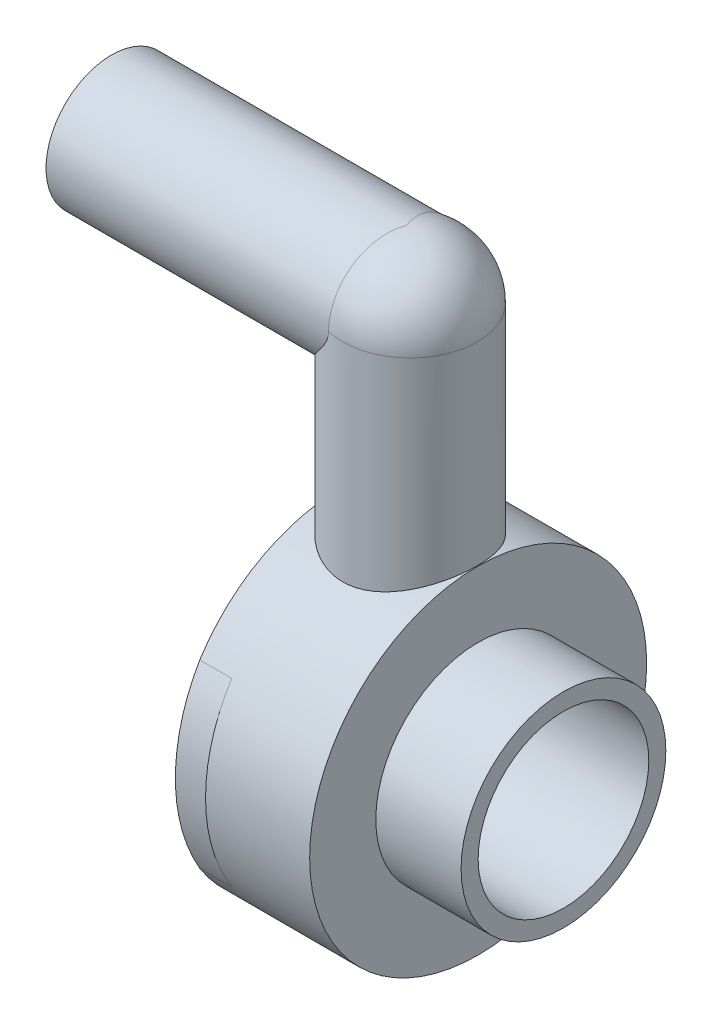
ISO-10303-21;
HEADER;
FILE_DESCRIPTION(('STEP AP214'),'2;1');
FILE_NAME('part.step','',(''),(''),'','','');
FILE_SCHEMA(('AUTOMOTIVE_DESIGN { 1 0 10303 214 1 1 1 1 }'));
ENDSEC;
DATA;
#1=APPLICATION_CONTEXT('core data for automotive mechanical design processes');
#2=APPLICATION_PROTOCOL_DEFINITION('international standard','automotive_design',2000,#1);
#3=PRODUCT_CONTEXT('',#1,'mechanical');
#4=PRODUCT('Part','Part','',(#3));
#5=PRODUCT_RELATED_PRODUCT_CATEGORY('part','',(#4));
#6=PRODUCT_DEFINITION_FORMATION('','',#4);
#7=PRODUCT_DEFINITION_CONTEXT('part definition',#1,'design');
#8=PRODUCT_DEFINITION('design','',#6,#7);
#9=PRODUCT_DEFINITION_SHAPE('','',#8);
#10=(LENGTH_UNIT() NAMED_UNIT(*) SI_UNIT(.MILLI.,.METRE.));
#11=(NAMED_UNIT(*) PLANE_ANGLE_UNIT() SI_UNIT($,.RADIAN.));
#12=(NAMED_UNIT(*) SI_UNIT($,.STERADIAN.) SOLID_ANGLE_UNIT());
#13=UNCERTAINTY_MEASURE_WITH_UNIT(LENGTH_MEASURE(1.E-05),#10,'distance_accuracy_value','');
#14=(GEOMETRIC_REPRESENTATION_CONTEXT(3) GLOBAL_UNCERTAINTY_ASSIGNED_CONTEXT((#13)) GLOBAL_UNIT_ASSIGNED_CONTEXT((#10,
#11,#12)) REPRESENTATION_CONTEXT('',''));
#15=CARTESIAN_POINT('',(0.,0.,0.));
#16=DIRECTION('',(0.,0.,1.));
#17=DIRECTION('',(1.,0.,0.));
#18=AXIS2_PLACEMENT_3D('',#15,#16,#17);
#19=CARTESIAN_POINT('',(10.3410488291802,0.,-2.00327059412866));
#20=DIRECTION('',(-1.,0.,0.));
#21=DIRECTION('',(0.,0.,1.));
#22=AXIS2_PLACEMENT_3D('',#19,#20,#21);
#23=CYLINDRICAL_SURFACE('',#22,2.);
#24=CARTESIAN_POINT('',(10.3410488291802,0.,-2.00327059412866));
#25=DIRECTION('',(1.,0.,0.));
#26=DIRECTION('',(0.,0.,-1.));
#27=AXIS2_PLACEMENT_3D('',#24,#25,#26);
#28=CIRCLE('',#27,2.);
#29=CARTESIAN_POINT('',(10.3410488291802,0.,-4.00327059412866));
#30=VERTEX_POINT('',#29);
#31=EDGE_CURVE('E180',#30,#30,#28,.T.);
#32=ORIENTED_EDGE('',*,*,#31,.T.);
#33=EDGE_LOOP('',(#32));
#34=FACE_BOUND('',#33,.T.);
#35=CARTESIAN_POINT('',(6.75,0.,-2.00327059412866));
#36=DIRECTION('',(-1.,0.,0.));
#37=DIRECTION('',(0.,0.,1.));
#38=AXIS2_PLACEMENT_3D('',#35,#36,#37);
#39=CIRCLE('',#38,2.);
#40=CARTESIAN_POINT('',(6.75,0.,-0.00327059412865956));
#41=VERTEX_POINT('',#40);
#42=EDGE_CURVE('E157',#41,#41,#39,.T.);
#43=ORIENTED_EDGE('',*,*,#42,.T.);
#44=EDGE_LOOP('',(#43));
#45=FACE_BOUND('',#44,.T.);
#46=ADVANCED_FACE('F57',(#34,#45),#23,.F.);
#47=CARTESIAN_POINT('',(5.15,1.5,0.));
#48=DIRECTION('',(1.,0.,0.));
#49=DIRECTION('',(0.,0.,-1.));
#50=AXIS2_PLACEMENT_3D('',#47,#48,#49);
#51=PLANE('',#50);
#52=CARTESIAN_POINT('',(5.15,0.,-2.00327059412866));
#53=DIRECTION('',(-1.,0.,0.));
#54=DIRECTION('',(0.,0.,1.));
#55=AXIS2_PLACEMENT_3D('',#52,#53,#54);
#56=CIRCLE('',#55,2.4);
#57=CARTESIAN_POINT('',(5.15,0.,0.39672940587134));
#58=VERTEX_POINT('',#57);
#59=EDGE_CURVE('E178',#58,#58,#56,.T.);
#60=ORIENTED_EDGE('',*,*,#59,.F.);
#61=EDGE_LOOP('',(#60));
#62=FACE_BOUND('',#61,.T.);
#63=CARTESIAN_POINT('',(5.15,0.,-2.00327059412866));
#64=DIRECTION('',(-1.,0.,0.));
#65=DIRECTION('',(0.,0.,1.));
#66=AXIS2_PLACEMENT_3D('',#63,#64,#65);
#67=CIRCLE('',#66,3.95);
#68=CARTESIAN_POINT('',(5.15,2.11517947952592,1.33267241638463));
#69=VERTEX_POINT('',#68);
#70=CARTESIAN_POINT('',(5.15,-2.11517947952593,1.33267241638462));
#71=VERTEX_POINT('',#70);
#72=EDGE_CURVE('E197',#69,#71,#67,.T.);
#73=ORIENTED_EDGE('',*,*,#72,.T.);
#74=CARTESIAN_POINT('',(5.15,0.,-2.29582806858006));
#75=DIRECTION('',(-1.,0.,0.));
#76=DIRECTION('',(0.,0.,-1.));
#77=AXIS2_PLACEMENT_3D('',#74,#75,#76);
#78=CIRCLE('',#77,4.19999999999959);
#79=EDGE_CURVE('E194',#71,#69,#78,.T.);
#80=ORIENTED_EDGE('',*,*,#79,.T.);
#81=EDGE_LOOP('',(#73,#80));
#82=FACE_BOUND('',#81,.T.);
#83=ADVANCED_FACE('F59',(#62,#82),#51,.F.);
#84=CARTESIAN_POINT('',(11.5273434496704,0.,-2.00327059412866));
#85=DIRECTION('',(-1.,0.,0.));
#86=DIRECTION('',(0.,0.,1.));
#87=AXIS2_PLACEMENT_3D('',#84,#85,#86);
#88=CYLINDRICAL_SURFACE('',#87,3.95);
#89=CARTESIAN_POINT('',(6.74552441459009,3.6201223583925,-3.58352820295917));
#90=CARTESIAN_POINT('',(6.66087168538759,3.62013091193356,-3.58351892014498));
#91=CARTESIAN_POINT('',(6.57609929526826,3.62313350345077,-3.57668575240974));
#92=CARTESIAN_POINT('',(6.40898639248176,3.6347685371744,-3.54960829353777));
#93=CARTESIAN_POINT('',(6.32665265566985,3.64341536170717,-3.52932973951682));
#94=CARTESIAN_POINT('',(6.16711784060708,3.665189674338,-3.47626004551848));
#95=CARTESIAN_POINT('',(6.08989869274277,3.67830025852264,-3.4435160567055));
#96=CARTESIAN_POINT('',(5.94206777334426,3.7075013170518,-3.36658271009673));
#97=CARTESIAN_POINT('',(5.87145456527196,3.72359114124811,-3.32239584859858));
#98=CARTESIAN_POINT('',(5.73475943307334,3.75796847201939,-3.22112631260328));
#99=CARTESIAN_POINT('',(5.66910263757841,3.77632668749479,-3.1634935423771));
#100=CARTESIAN_POINT('',(5.54807578805564,3.81258826570161,-3.03812619364975));
#101=CARTESIAN_POINT('',(5.49270932939621,3.83049146757563,-2.9703880992678));
#102=CARTESIAN_POINT('',(5.39172436468551,3.86467469753172,-2.82344866597181));
#103=CARTESIAN_POINT('',(5.34657653727795,3.88086283829671,-2.74390054255209));
#104=CARTESIAN_POINT('',(5.27048476021388,3.90893484184613,-2.57757490872957));
#105=CARTESIAN_POINT('',(5.23953502897548,3.92082045623822,-2.49080035802568));
#106=CARTESIAN_POINT('',(5.19423535064363,3.93844757824245,-2.31694293338523));
#107=CARTESIAN_POINT('',(5.17915410550622,3.9444587537082,-2.23007849386802));
#108=CARTESIAN_POINT('',(5.16366464543276,3.95063441784333,-2.05485777436098));
#109=CARTESIAN_POINT('',(5.16325095594824,3.9508010879276,-1.96650206329591));
#110=CARTESIAN_POINT('',(5.17670751029317,3.94543303169185,-1.79609309960282));
#111=CARTESIAN_POINT('',(5.18977647784626,3.9402181279179,-1.71396467064679));
#112=CARTESIAN_POINT('',(5.22846440201187,3.92510400490958,-1.55317963638368));
#113=CARTESIAN_POINT('',(5.25408427950465,3.91520444195611,-1.47452328629026));
#114=CARTESIAN_POINT('',(5.31746134833689,3.8915005221343,-1.32149771631342));
#115=CARTESIAN_POINT('',(5.35539565723217,3.87763955980875,-1.24721098232893));
#116=CARTESIAN_POINT('',(5.44215876707929,3.8473883152174,-1.10586586226057));
#117=CARTESIAN_POINT('',(5.49099130254849,3.8309971665226,-1.03880996569287));
#118=CARTESIAN_POINT('',(5.60190236000161,3.79607834965128,-0.909154643348896));
#119=CARTESIAN_POINT('',(5.66464017751957,3.77748106392884,-0.847137103011792));
#120=CARTESIAN_POINT('',(5.79969795170699,3.74107596687102,-0.734264876543018));
#121=CARTESIAN_POINT('',(5.87202103443174,3.7232684156323,-0.683413846596622));
#122=CARTESIAN_POINT('',(6.02679889815059,3.68998543664153,-0.59298640284196));
#123=CARTESIAN_POINT('',(6.10948226379648,3.67459014849226,-0.553769272386424));
#124=CARTESIAN_POINT('',(6.28105942241714,3.64881476485353,-0.490046737013045));
#125=CARTESIAN_POINT('',(6.36994913813199,3.63843141160661,-0.465531773167811));
#126=CARTESIAN_POINT('',(6.54561129051332,3.6246464323762,-0.433325208541002));
#127=CARTESIAN_POINT('',(6.63218118135231,3.62085694193695,-0.424697112902629));
#128=CARTESIAN_POINT('',(6.80559590846535,3.61958375127218,-0.421777847233126));
#129=CARTESIAN_POINT('',(6.89244065333252,3.62209813784275,-0.42748232731817));
#130=CARTESIAN_POINT('',(7.05873708727876,3.63275132501296,-0.452213612632866));
#131=CARTESIAN_POINT('',(7.13832806701208,3.64056147104671,-0.470462762689689));
#132=CARTESIAN_POINT('',(7.29326546264509,3.66051844198353,-0.518756416065084));
#133=CARTESIAN_POINT('',(7.3686109329625,3.67266622860306,-0.548803535308065));
#134=CARTESIAN_POINT('',(7.51632663803317,3.70053256125568,-0.62120077424619));
#135=CARTESIAN_POINT('',(7.58845223800516,3.71637595489804,-0.6640004807151));
#136=CARTESIAN_POINT('',(7.72482588123237,3.74965800815206,-0.760228398801046));
#137=CARTESIAN_POINT('',(7.78907069825265,3.76709731603186,-0.81366093997115));
#138=CARTESIAN_POINT('',(7.91279359166655,3.80316226883481,-0.934299081892597));
#139=CARTESIAN_POINT('',(7.97156863999922,3.82178035297597,-1.00223066895189));
#140=CARTESIAN_POINT('',(8.07699409402721,3.85689277015878,-1.14743705363315));
#141=CARTESIAN_POINT('',(8.12364400481408,3.87338701649846,-1.2247122324414));
#142=CARTESIAN_POINT('',(8.20332312469146,3.90244581135783,-1.38668601062125));
#143=CARTESIAN_POINT('',(8.23635546063284,3.91501126184257,-1.47138290040654));
#144=CARTESIAN_POINT('',(8.28748470107642,3.93476369259619,-1.64575782355828));
#145=CARTESIAN_POINT('',(8.30558971410393,3.94195359266725,-1.73543312435618));
#146=CARTESIAN_POINT('',(8.32538696156867,3.9498326198075,-1.91090740841367));
#147=CARTESIAN_POINT('',(8.32807321205477,3.95091537637663,-1.99657743100902));
#148=CARTESIAN_POINT('',(8.31958182229576,3.94752157619822,-2.16710607302792));
#149=CARTESIAN_POINT('',(8.30840628187497,3.94304586146391,-2.25196481338476));
#150=CARTESIAN_POINT('',(8.27321883383373,3.92923492542663,-2.41578826432596));
#151=CARTESIAN_POINT('',(8.24961201410713,3.92005329100409,-2.49485396720056));
#152=CARTESIAN_POINT('',(8.19065781781364,3.89781394266726,-2.64788787211574));
#153=CARTESIAN_POINT('',(8.1553082761675,3.88475551401133,-2.72185513108521));
#154=CARTESIAN_POINT('',(8.07211202687606,3.85532650998991,-2.8661855623357));
#155=CARTESIAN_POINT('',(8.02378205269335,3.83883506024146,-2.9362449804473));
#156=CARTESIAN_POINT('',(7.9167194221369,3.80452557659907,-3.06755387319176));
#157=CARTESIAN_POINT('',(7.85798245812947,3.78670699515938,-3.12879968062119));
#158=CARTESIAN_POINT('',(7.72747570477016,3.75037999148351,-3.24466638297305));
#159=CARTESIAN_POINT('',(7.65512406594874,3.73189718796616,-3.29864209471394));
#160=CARTESIAN_POINT('',(7.50180297141913,3.69752363549344,-3.39373345827435));
#161=CARTESIAN_POINT('',(7.4208325051269,3.68163319105459,-3.43484759980409));
#162=CARTESIAN_POINT('',(7.2599566820615,3.65570766367631,-3.4997372228449));
#163=CARTESIAN_POINT('',(7.18060875191331,3.64527488275645,-3.52473826180571));
#164=CARTESIAN_POINT('',(7.01862178966136,3.62952165227984,-3.56195475451409));
#165=CARTESIAN_POINT('',(6.93599260052781,3.6241869621455,-3.57420583151582));
#166=CARTESIAN_POINT('',(6.81719482595488,3.62065196718803,-3.58231249243116));
#167=CARTESIAN_POINT('',(6.78137034830785,3.62011873642226,-3.58353213373783));
#168=CARTESIAN_POINT('',(6.74552441459009,3.6201223583925,-3.58352820295917));
#169=B_SPLINE_CURVE_WITH_KNOTS('',3,(#89,#90,#91,#92,#93,#94,#95,#96,#97,#98,#99,#100,#101,#102,
#103,#104,#105,#106,#107,#108,#109,#110,#111,#112,#113,#114,#115,#116,#117,#118,#119,#120,#121,
#122,#123,#124,#125,#126,#127,#128,#129,#130,#131,#132,#133,#134,#135,#136,#137,#138,#139,#140,
#141,#142,#143,#144,#145,#146,#147,#148,#149,#150,#151,#152,#153,#154,#155,#156,#157,#158,#159,
#160,#161,#162,#163,#164,#165,#166,#167,#168),.UNSPECIFIED.,.T.,.F.,(4,2,2,2,2,2,2,2,2,2,2,2,2,
2,2,2,2,2,2,2,2,2,2,2,2,2,2,2,2,2,2,2,2,2,2,2,2,2,2,4),(0.,0.25384677035522,0.508342917612336,
0.761885833664008,1.01537348508021,1.28201181380666,1.54874312959799,1.82599614465866,
2.10313615956916,2.36685505767649,2.63047552376619,2.87928374445415,3.12811022333259,
3.38068710041273,3.63335066178025,3.90260753775397,4.17195244391409,4.44891002063421,
4.72568733170541,4.98555140966889,5.2453366293713,5.49031876230415,5.73535524501086,
5.99033060615514,6.2454100032057,6.51933818467105,6.79327754523347,7.06715396909235,
7.34088152501584,7.59674513412525,7.85256998900568,8.10053196703236,8.34853968876227,
8.6075080837327,8.86658392170314,9.14170441345788,9.41685719954569,9.66729872620164,
9.91703862794073,10.0245292498066),.UNSPECIFIED.);
#170=CARTESIAN_POINT('',(6.74552441459009,3.6201223583925,-3.58352820295917));
#171=VERTEX_POINT('',#170);
#172=EDGE_CURVE('E70',#171,#171,#169,.T.);
#173=ORIENTED_EDGE('',*,*,#172,.F.);
#174=EDGE_LOOP('',(#173));
#175=FACE_BOUND('',#174,.T.);
#176=CARTESIAN_POINT('',(8.34104882918019,0.,-2.00327059412866));
#177=DIRECTION('',(-1.,0.,0.));
#178=DIRECTION('',(0.,0.,1.));
#179=AXIS2_PLACEMENT_3D('',#176,#177,#178);
#180=CIRCLE('',#179,3.95);
#181=CARTESIAN_POINT('',(8.34104882918019,0.,1.94672940587134));
#182=VERTEX_POINT('',#181);
#183=EDGE_CURVE('E201',#182,#182,#180,.T.);
#184=ORIENTED_EDGE('',*,*,#183,.T.);
#185=EDGE_LOOP('',(#184));
#186=FACE_BOUND('',#185,.T.);
#187=DIRECTION('',(-1.,0.,0.));
#188=VECTOR('',#187,1.);
#189=CARTESIAN_POINT('',(6.74552441459009,-2.11517947952592,1.33267241638463));
#190=LINE('',#189,#188);
#191=CARTESIAN_POINT('',(5.9,-2.11517947952592,1.33267241638463));
#192=VERTEX_POINT('',#191);
#193=EDGE_CURVE('E156',#71,#192,#190,.F.);
#194=ORIENTED_EDGE('',*,*,#193,.F.);
#195=ORIENTED_EDGE('',*,*,#72,.F.);
#196=DIRECTION('',(-1.,0.,0.));
#197=VECTOR('',#196,1.);
#198=CARTESIAN_POINT('',(6.74552441459009,2.11517947952592,1.33267241638463));
#199=LINE('',#198,#197);
#200=CARTESIAN_POINT('',(5.9,2.11517947952592,1.33267241638463));
#201=VERTEX_POINT('',#200);
#202=EDGE_CURVE('E206',#201,#69,#199,.T.);
#203=ORIENTED_EDGE('',*,*,#202,.F.);
#204=CARTESIAN_POINT('',(5.9,0.,-2.00327059412866));
#205=DIRECTION('',(-1.,0.,0.));
#206=DIRECTION('',(0.,0.,1.));
#207=AXIS2_PLACEMENT_3D('',#204,#205,#206);
#208=CIRCLE('',#207,3.95);
#209=EDGE_CURVE('E204',#192,#201,#208,.T.);
#210=ORIENTED_EDGE('',*,*,#209,.F.);
#211=EDGE_LOOP('',(#194,#195,#203,#210));
#212=FACE_BOUND('',#211,.T.);
#213=ADVANCED_FACE('F123',(#175,#186,#212),#88,.T.);
#214=CARTESIAN_POINT('',(8.34104882918019,3.95,-2.00327059412866));
#215=DIRECTION('',(1.,0.,0.));
#216=DIRECTION('',(0.,0.,-1.));
#217=AXIS2_PLACEMENT_3D('',#214,#215,#216);
#218=PLANE('',#217);
#219=CARTESIAN_POINT('',(8.34104882918019,0.,-2.00327059412866));
#220=DIRECTION('',(1.,0.,0.));
#221=DIRECTION('',(0.,0.,-1.));
#222=AXIS2_PLACEMENT_3D('',#219,#220,#221);
#223=CIRCLE('',#222,2.4);
#224=CARTESIAN_POINT('',(8.34104882918019,0.,-4.40327059412866));
#225=VERTEX_POINT('',#224);
#226=EDGE_CURVE('E188',#225,#225,#223,.T.);
#227=ORIENTED_EDGE('',*,*,#226,.F.);
#228=EDGE_LOOP('',(#227));
#229=FACE_BOUND('',#228,.T.);
#230=ORIENTED_EDGE('',*,*,#183,.F.);
#231=EDGE_LOOP('',(#230));
#232=FACE_BOUND('',#231,.T.);
#233=ADVANCED_FACE('F144',(#229,#232),#218,.T.);
#234=CARTESIAN_POINT('',(5.15,0.,-2.29582806858006));
#235=DIRECTION('',(1.,0.,0.));
#236=DIRECTION('',(0.,0.,-1.));
#237=AXIS2_PLACEMENT_3D('',#234,#235,#236);
#238=CYLINDRICAL_SURFACE('',#237,4.19999999999959);
#239=CARTESIAN_POINT('',(5.9,0.,-2.29582806858006));
#240=DIRECTION('',(-1.,0.,0.));
#241=DIRECTION('',(0.,0.,-1.));
#242=AXIS2_PLACEMENT_3D('',#239,#240,#241);
#243=CIRCLE('',#242,4.19999999999959);
#244=EDGE_CURVE('E82',#192,#201,#243,.T.);
#245=ORIENTED_EDGE('',*,*,#244,.T.);
#246=ORIENTED_EDGE('',*,*,#202,.T.);
#247=ORIENTED_EDGE('',*,*,#79,.F.);
#248=ORIENTED_EDGE('',*,*,#193,.T.);
#249=EDGE_LOOP('',(#245,#246,#247,#248));
#250=FACE_BOUND('',#249,.T.);
#251=ADVANCED_FACE('F141',(#250),#238,.T.);
#252=CARTESIAN_POINT('',(5.9,0.,-1.14791403429003));
#253=DIRECTION('',(1.,0.,0.));
#254=DIRECTION('',(0.,0.,-1.));
#255=AXIS2_PLACEMENT_3D('',#252,#253,#254);
#256=PLANE('',#255);
#257=ORIENTED_EDGE('',*,*,#209,.T.);
#258=ORIENTED_EDGE('',*,*,#244,.F.);
#259=EDGE_LOOP('',(#257,#258));
#260=FACE_BOUND('',#259,.T.);
#261=ADVANCED_FACE('F135',(#260),#256,.F.);
#262=CARTESIAN_POINT('',(10.3410488291802,0.,-2.00327059412866));
#263=DIRECTION('',(1.,0.,0.));
#264=DIRECTION('',(0.,0.,-1.));
#265=AXIS2_PLACEMENT_3D('',#262,#263,#264);
#266=PLANE('',#265);
#267=CARTESIAN_POINT('',(10.3410488291802,0.,-2.00327059412866));
#268=DIRECTION('',(1.,0.,0.));
#269=DIRECTION('',(0.,0.,-1.));
#270=AXIS2_PLACEMENT_3D('',#267,#268,#269);
#271=CIRCLE('',#270,2.4);
#272=CARTESIAN_POINT('',(10.3410488291802,0.,-4.40327059412866));
#273=VERTEX_POINT('',#272);
#274=EDGE_CURVE('E189',#273,#273,#271,.T.);
#275=ORIENTED_EDGE('',*,*,#274,.T.);
#276=EDGE_LOOP('',(#275));
#277=FACE_BOUND('',#276,.T.);
#278=ORIENTED_EDGE('',*,*,#31,.F.);
#279=EDGE_LOOP('',(#278));
#280=FACE_BOUND('',#279,.T.);
#281=ADVANCED_FACE('F131',(#277,#280),#266,.T.);
#282=CARTESIAN_POINT('',(10.3410488291802,0.,-2.00327059412866));
#283=DIRECTION('',(-1.,0.,0.));
#284=DIRECTION('',(0.,0.,1.));
#285=AXIS2_PLACEMENT_3D('',#282,#283,#284);
#286=CYLINDRICAL_SURFACE('',#285,2.4);
#287=ORIENTED_EDGE('',*,*,#274,.F.);
#288=EDGE_LOOP('',(#287));
#289=FACE_BOUND('',#288,.T.);
#290=ORIENTED_EDGE('',*,*,#226,.T.);
#291=EDGE_LOOP('',(#290));
#292=FACE_BOUND('',#291,.T.);
#293=ADVANCED_FACE('F134',(#289,#292),#286,.T.);
#294=CARTESIAN_POINT('',(6.75,0.,-2.00327059412866));
#295=DIRECTION('',(-1.,0.,0.));
#296=DIRECTION('',(0.,0.,1.));
#297=AXIS2_PLACEMENT_3D('',#294,#295,#296);
#298=CYLINDRICAL_SURFACE('',#297,2.4);
#299=CARTESIAN_POINT('',(6.75,0.,-2.00327059412866));
#300=DIRECTION('',(-1.,0.,0.));
#301=DIRECTION('',(0.,0.,1.));
#302=AXIS2_PLACEMENT_3D('',#299,#300,#301);
#303=CIRCLE('',#302,2.4);
#304=CARTESIAN_POINT('',(6.75,0.,0.39672940587134));
#305=VERTEX_POINT('',#304);
#306=EDGE_CURVE('E177',#305,#305,#303,.T.);
#307=ORIENTED_EDGE('',*,*,#306,.F.);
#308=EDGE_LOOP('',(#307));
#309=FACE_BOUND('',#308,.T.);
#310=ORIENTED_EDGE('',*,*,#59,.T.);
#311=EDGE_LOOP('',(#310));
#312=FACE_BOUND('',#311,.T.);
#313=ADVANCED_FACE('F129',(#309,#312),#298,.F.);
#314=CARTESIAN_POINT('',(6.75,0.,-2.00327059412866));
#315=DIRECTION('',(-1.,0.,0.));
#316=DIRECTION('',(0.,0.,1.));
#317=AXIS2_PLACEMENT_3D('',#314,#315,#316);
#318=PLANE('',#317);
#319=ORIENTED_EDGE('',*,*,#42,.F.);
#320=EDGE_LOOP('',(#319));
#321=FACE_BOUND('',#320,.T.);
#322=ORIENTED_EDGE('',*,*,#306,.T.);
#323=EDGE_LOOP('',(#322));
#324=FACE_BOUND('',#323,.T.);
#325=ADVANCED_FACE('F162',(#321,#324),#318,.T.);
#326=CARTESIAN_POINT('',(6.74552441459009,9.14805982748559,-2.00327059412866));
#327=DIRECTION('',(0.,-1.,0.));
#328=DIRECTION('',(0.,0.,-1.));
#329=AXIS2_PLACEMENT_3D('',#326,#327,#328);
#330=CYLINDRICAL_SURFACE('',#329,1.58025760883051);
#331=CARTESIAN_POINT('',(6.36978904906784,8.49349569386591,-3.53820936989874));
#332=CARTESIAN_POINT('',(6.36979140912852,8.46800877851619,-3.53820970352093));
#333=CARTESIAN_POINT('',(6.36713109628353,8.44252366533139,-3.53756533377563));
#334=CARTESIAN_POINT('',(6.35722791882064,8.39246417515369,-3.53508791256665));
#335=CARTESIAN_POINT('',(6.34996247138656,8.36789492166026,-3.53324900216305));
#336=CARTESIAN_POINT('',(6.32648831115353,8.30431072028323,-3.52703009602013));
#337=CARTESIAN_POINT('',(6.30754121155032,8.26644543248222,-3.52177413273972));
#338=CARTESIAN_POINT('',(6.26559382962549,8.19342416494748,-3.50905057780424));
#339=CARTESIAN_POINT('',(6.24257486383857,8.15828179658605,-3.5015726785573));
#340=CARTESIAN_POINT('',(6.18222433410545,8.07217289519815,-3.48022218445741));
#341=CARTESIAN_POINT('',(6.14364331965314,8.02241291617715,-3.46504193257098));
#342=CARTESIAN_POINT('',(6.0651163035515,7.92556102729843,-3.43019981111564));
#343=CARTESIAN_POINT('',(6.02516831038077,7.87847330115743,-3.41053114366023));
#344=CARTESIAN_POINT('',(5.94521149085361,7.78650218918895,-3.36664573853505));
#345=CARTESIAN_POINT('',(5.90520266472829,7.74161879500923,-3.34242901809957));
#346=CARTESIAN_POINT('',(5.82599682218316,7.65403307570399,-3.28933344407734));
#347=CARTESIAN_POINT('',(5.78679917957468,7.61132902782919,-3.26045835044967));
#348=CARTESIAN_POINT('',(5.68720419499096,7.50380396798219,-3.17944159953619));
#349=CARTESIAN_POINT('',(5.62787095632569,7.44071708570716,-3.12359280315511));
#350=CARTESIAN_POINT('',(5.51557189265921,7.32219120395793,-2.99898304156059));
#351=CARTESIAN_POINT('',(5.46259218154074,7.26673548534653,-2.93025110905853));
#352=CARTESIAN_POINT('',(5.37851807581734,7.17909866918416,-2.79884710283499));
#353=CARTESIAN_POINT('',(5.34528909312291,7.14458968482792,-2.73910560853337));
#354=CARTESIAN_POINT('',(5.28583553237421,7.08297092894319,-2.61268277876179));
#355=CARTESIAN_POINT('',(5.25960320818679,7.05585297393238,-2.54600923255811));
#356=CARTESIAN_POINT('',(5.21919288963769,7.01412640859973,-2.41724881701145));
#357=CARTESIAN_POINT('',(5.20380213620074,6.99825694680978,-2.35595532587411));
#358=CARTESIAN_POINT('',(5.18039353193635,6.97413192913753,-2.2305167953892));
#359=CARTESIAN_POINT('',(5.17237135922569,6.96587191009115,-2.16637345073906));
#360=CARTESIAN_POINT('',(5.16428923364205,6.95755017274164,-2.03686883088315));
#361=CARTESIAN_POINT('',(5.16425122793428,6.95751105234007,-1.9715046924906));
#362=CARTESIAN_POINT('',(5.17219567842994,6.96569100976719,-1.84179273654231));
#363=CARTESIAN_POINT('',(5.18017940394371,6.97391139453013,-1.77744508146547));
#364=CARTESIAN_POINT('',(5.20308875610941,6.99752159667958,-1.65415101832017));
#365=CARTESIAN_POINT('',(5.21772457458595,7.01261214684416,-1.59509153854046));
#366=CARTESIAN_POINT('',(5.25293583599128,7.04896680169533,-1.48079920693447));
#367=CARTESIAN_POINT('',(5.27351343596417,7.07023314839655,-1.42556775384182));
#368=CARTESIAN_POINT('',(5.32887055654843,7.12754984528422,-1.29839640624924));
#369=CARTESIAN_POINT('',(5.36603732407155,7.16611009101679,-1.22862355916665));
#370=CARTESIAN_POINT('',(5.44753276131584,7.25102057125897,-1.09864274060224));
#371=CARTESIAN_POINT('',(5.49187757575677,7.29738837606348,-1.03845695216854));
#372=CARTESIAN_POINT('',(5.60290572413319,7.41420769657781,-0.907143661631831));
#373=CARTESIAN_POINT('',(5.67179733469534,7.48723592933555,-0.840162667864694));
#374=CARTESIAN_POINT('',(5.77878836260853,7.60265164483387,-0.752361725164488));
#375=CARTESIAN_POINT('',(5.81509020568755,7.64213496830825,-0.725190545474868));
#376=CARTESIAN_POINT('',(5.88842738508159,7.72295640267586,-0.674899315796652));
#377=CARTESIAN_POINT('',(5.92546244695649,7.76429382665539,-0.651777780801235));
#378=CARTESIAN_POINT('',(6.00646842933463,7.85662481667775,-0.605568889306608));
#379=CARTESIAN_POINT('',(6.0504595099017,7.90799378319254,-0.58327340286575));
#380=CARTESIAN_POINT('',(6.13703473451169,8.01384685058646,-0.544100893546005));
#381=CARTESIAN_POINT('',(6.17962095894132,8.06832598587084,-0.527215503196884));
#382=CARTESIAN_POINT('',(6.23974212495737,8.15430824943655,-0.505983692444783));
#383=CARTESIAN_POINT('',(6.25927348532695,8.1838914175793,-0.499560343983215));
#384=CARTESIAN_POINT('',(6.29571846779501,8.24498330822574,-0.488263571845225));
#385=CARTESIAN_POINT('',(6.31263312153969,8.27649126500525,-0.483389536542903));
#386=CARTESIAN_POINT('',(6.33679873050313,8.33141385662356,-0.476750835386982));
#387=CARTESIAN_POINT('',(6.345406018432,8.35415202471853,-0.474490357738387));
#388=CARTESIAN_POINT('',(6.35913303133118,8.40069846069556,-0.470962983917027));
#389=CARTESIAN_POINT('',(6.36426587387804,8.42450233780823,-0.469692347878345));
#390=CARTESIAN_POINT('',(6.37000699254019,8.47303769911487,-0.468274799047031));
#391=CARTESIAN_POINT('',(6.37055625439594,8.49777717426921,-0.468142542373706));
#392=CARTESIAN_POINT('',(6.36681315747767,8.54687198384975,-0.469062598409401));
#393=CARTESIAN_POINT('',(6.36251291717784,8.57122662752609,-0.470116839436971));
#394=CARTESIAN_POINT('',(6.34816592669918,8.62630050798736,-0.473765186223369));
#395=CARTESIAN_POINT('',(6.33673734493662,8.65661280310405,-0.476739273086349));
#396=CARTESIAN_POINT('',(6.30997987551161,8.71533007008654,-0.484155745169803));
#397=CARTESIAN_POINT('',(6.29463007615141,8.74372374995632,-0.488606042182363));
#398=CARTESIAN_POINT('',(6.2519901517752,8.81547658902337,-0.501810059437634));
#399=CARTESIAN_POINT('',(6.22304384510495,8.85764626769002,-0.511546578114287));
#400=CARTESIAN_POINT('',(6.16292697985818,8.93958523018362,-0.533971287888552));
#401=CARTESIAN_POINT('',(6.13175166057901,8.97934901985389,-0.546665935873886));
#402=CARTESIAN_POINT('',(6.06844111110284,9.0572142324809,-0.574992744286575));
#403=CARTESIAN_POINT('',(6.03630359834893,9.09531107025811,-0.590632447554481));
#404=CARTESIAN_POINT('',(5.97192117613513,9.16998346226214,-0.624835602018407));
#405=CARTESIAN_POINT('',(5.93967639542449,9.20656040764285,-0.643396301644197));
#406=CARTESIAN_POINT('',(5.837554960249,9.32083826780952,-0.707267803904285));
#407=CARTESIAN_POINT('',(5.7682720395089,9.39601622437762,-0.758254687947256));
#408=CARTESIAN_POINT('',(5.63511862118098,9.53869398239511,-0.875410650285315));
#409=CARTESIAN_POINT('',(5.5712333490175,9.60621492869763,-0.941536316721613));
#410=CARTESIAN_POINT('',(5.46884251291622,9.71371200881085,-1.06944171321236));
#411=CARTESIAN_POINT('',(5.42818952564729,9.75615603315619,-1.12741361504524));
#412=CARTESIAN_POINT('',(5.35347398294504,9.83392209095194,-1.25183299188168));
#413=CARTESIAN_POINT('',(5.31940480810606,9.86925127922387,-1.3182718414257));
#414=CARTESIAN_POINT('',(5.26508384483842,9.92547688090615,-1.4469258766253));
#415=CARTESIAN_POINT('',(5.2434667421903,9.94780689064289,-1.50793106434796));
#416=CARTESIAN_POINT('',(5.20755248899441,9.98487146216909,-1.63427425247603));
#417=CARTESIAN_POINT('',(5.19325025645881,9.99961129726231,-1.69960920904159));
#418=CARTESIAN_POINT('',(5.17297184138092,10.0205028776589,-1.83331353464334));
#419=CARTESIAN_POINT('',(5.16704217817499,10.0266066399398,-1.90169769657815));
#420=CARTESIAN_POINT('',(5.16418046340002,10.0295529211325,-2.03885177387868));
#421=CARTESIAN_POINT('',(5.16724653045714,10.0263973765427,-2.10762160558271));
#422=CARTESIAN_POINT('',(5.18141493243607,10.0118052732928,-2.23699419439535));
#423=CARTESIAN_POINT('',(5.19176376898205,10.0011451289238,-2.2977722783635));
#424=CARTESIAN_POINT('',(5.21896510358822,9.97309629440705,-2.41621884273746));
#425=CARTESIAN_POINT('',(5.2358190977195,9.95570605645446,-2.47388660434447));
#426=CARTESIAN_POINT('',(5.27643146676348,9.91373758234059,-2.58889026014115));
#427=CARTESIAN_POINT('',(5.30058200655178,9.88875034750475,-2.64593586696425));
#428=CARTESIAN_POINT('',(5.35401969030106,9.83333227818472,-2.75467279197466));
#429=CARTESIAN_POINT('',(5.38330849515697,9.80289968347654,-2.80636237025741));
#430=CARTESIAN_POINT('',(5.4637408516139,9.71905794533061,-2.93200217167451));
#431=CARTESIAN_POINT('',(5.51784551265025,9.66241957148334,-3.00191019755359));
#432=CARTESIAN_POINT('',(5.63266801264311,9.54119026602292,-3.12848388751233));
#433=CARTESIAN_POINT('',(5.69341169696194,9.47656811691566,-3.18509488640402));
#434=CARTESIAN_POINT('',(5.79628725696501,9.36535770443391,-3.26772248252489));
#435=CARTESIAN_POINT('',(5.83737690211382,9.3205048292837,-3.29746796046427));
#436=CARTESIAN_POINT('',(5.92037179476493,9.22841520875548,-3.35189881509042));
#437=CARTESIAN_POINT('',(5.96227792072696,9.1811757975033,-3.37657836987584));
#438=CARTESIAN_POINT('',(6.04569522740365,9.08441061659027,-3.42090226038335));
#439=CARTESIAN_POINT('',(6.08720727932532,9.03489348635003,-3.44056402565398));
#440=CARTESIAN_POINT('',(6.16834909668953,8.93277781746443,-3.47500019377517));
#441=CARTESIAN_POINT('',(6.20798285365067,8.88018639748897,-3.48978539895484));
#442=CARTESIAN_POINT('',(6.26272393018372,8.79735353787528,-3.5080951203964));
#443=CARTESIAN_POINT('',(6.28017306779078,8.76911088929472,-3.5135506518828));
#444=CARTESIAN_POINT('',(6.31218607139129,8.71076474949044,-3.52304223444418));
#445=CARTESIAN_POINT('',(6.32675321479498,8.68066342369171,-3.5270799020156));
#446=CARTESIAN_POINT('',(6.3482446930024,8.62455466976524,-3.53280737740671));
#447=CARTESIAN_POINT('',(6.35612160840493,8.59896321580647,-3.53480798269075));
#448=CARTESIAN_POINT('',(6.36687901741023,8.54674145552183,-3.53750527125256));
#449=CARTESIAN_POINT('',(6.36978658390902,8.52011759157054,-3.53820902141971));
#450=CARTESIAN_POINT('',(6.36978904906784,8.49349569386591,-3.53820936989874));
#451=B_SPLINE_CURVE_WITH_KNOTS('',3,(#331,#332,#333,#334,#335,#336,#337,#338,#339,#340,#341,
#342,#343,#344,#345,#346,#347,#348,#349,#350,#351,#352,#353,#354,#355,#356,#357,#358,#359,#360,
#361,#362,#363,#364,#365,#366,#367,#368,#369,#370,#371,#372,#373,#374,#375,#376,#377,#378,#379,
#380,#381,#382,#383,#384,#385,#386,#387,#388,#389,#390,#391,#392,#393,#394,#395,#396,#397,#398,
#399,#400,#401,#402,#403,#404,#405,#406,#407,#408,#409,#410,#411,#412,#413,#414,#415,#416,#417,
#418,#419,#420,#421,#422,#423,#424,#425,#426,#427,#428,#429,#430,#431,#432,#433,#434,#435,#436,
#437,#438,#439,#440,#441,#442,#443,#444,#445,#446,#447,#448,#449,#450),.UNSPECIFIED.,.T.,.F.,(4,
2,2,2,2,2,2,2,2,2,2,2,2,2,2,2,2,2,2,2,2,2,2,2,2,2,2,2,2,2,2,2,2,2,2,2,2,2,2,2,2,2,2,2,2,2,2,2,2,
2,2,2,2,2,2,2,2,2,2,4),(0.,0.0763423067570712,0.153061910918575,0.280337222109067,
0.408212436866334,0.602164702445901,0.796412689393444,0.990659940276275,1.18475118371711,
1.49278989437291,1.80014259515072,2.02905096463742,2.25770484336413,2.4523406102225,
2.64686214460725,2.84191837979952,3.03700548437456,3.22430562379164,3.41167384442377,
3.67408058273312,3.93708593829063,4.29705413798589,4.47731480752455,4.65750923635175,
4.8709179957016,5.08399507716233,5.19198335955476,5.29992895806868,5.37297807397495,
5.44574983534347,5.51945712069004,5.59328436971685,5.69032766901025,5.78789971261805,
5.94374342943843,6.09993055605154,6.25652328641671,6.41296938021651,6.75443462981678,
7.09493269624843,7.34177032887197,7.58835848331437,7.7929202361434,7.99733967648874,
8.20289049370453,8.40839832493121,8.59528128357167,8.78220724761883,8.98186849971682,
9.18159440971531,9.49481909577966,9.80930977751463,10.0122307153026,10.215383565791,
10.4178208432331,10.6198066312681,10.7206266186289,10.8213312857885,10.9015114942791,
10.9812534737668),.UNSPECIFIED.);
#452=CARTESIAN_POINT('',(6.36978904906744,8.49349569386591,-3.53820936989865));
#453=VERTEX_POINT('',#452);
#454=CARTESIAN_POINT('',(6.36978904906785,8.49349569386591,-0.468331818358572));
#455=VERTEX_POINT('',#454);
#456=EDGE_CURVE('E13',#453,#455,#451,.T.);
#457=ORIENTED_EDGE('',*,*,#456,.F.);
#458=CARTESIAN_POINT('',(6.74552441459009,8.49349569386591,-2.00327059412866));
#459=DIRECTION('',(0.,-1.,0.));
#460=DIRECTION('',(0.,0.,-1.));
#461=AXIS2_PLACEMENT_3D('',#458,#459,#460);
#462=CIRCLE('',#461,1.58025760883051);
#463=EDGE_CURVE('E182',#453,#455,#462,.T.);
#464=ORIENTED_EDGE('',*,*,#463,.T.);
#465=EDGE_LOOP('',(#457,#464));
#466=FACE_BOUND('',#465,.T.);
#467=ORIENTED_EDGE('',*,*,#172,.T.);
#468=EDGE_LOOP('',(#467));
#469=FACE_BOUND('',#468,.T.);
#470=ADVANCED_FACE('F159',(#466,#469),#330,.T.);
#471=CARTESIAN_POINT('',(-0.254475585409906,8.49349569386591,-2.00327059412866));
#472=DIRECTION('',(1.,0.,0.));
#473=DIRECTION('',(0.,0.,-1.));
#474=AXIS2_PLACEMENT_3D('',#471,#472,#473);
#475=CYLINDRICAL_SURFACE('',#474,1.53493877577008);
#476=CARTESIAN_POINT('',(6.36978905061623,8.49329569386591,-3.53820935686891));
#477=CARTESIAN_POINT('',(6.3697889774885,8.53622376194916,-3.5382148126596));
#478=CARTESIAN_POINT('',(6.37000178447588,8.57913146020046,-3.53641852042408));
#479=CARTESIAN_POINT('',(6.3708558147638,8.66463938527959,-3.52924222929646));
#480=CARTESIAN_POINT('',(6.37149701436017,8.70723962898793,-3.52386242869002));
#481=CARTESIAN_POINT('',(6.37406429801588,8.83404190531984,-3.50240157833805));
#482=CARTESIAN_POINT('',(6.37663405100021,8.91739372809177,-3.4809989436018));
#483=CARTESIAN_POINT('',(6.3835216953916,9.07928928716022,-3.42462330752138));
#484=CARTESIAN_POINT('',(6.38784034053099,9.157830933558,-3.38964445541002));
#485=CARTESIAN_POINT('',(6.39828837030485,9.307893796997,-3.30715617835824));
#486=CARTESIAN_POINT('',(6.40441743269845,9.37941626038511,-3.25964898353119));
#487=CARTESIAN_POINT('',(6.41861404053841,9.51356088147166,-3.15341802361605));
#488=CARTESIAN_POINT('',(6.42668498275714,9.57616713385439,-3.09467464130702));
#489=CARTESIAN_POINT('',(6.44497020380837,9.69061387839082,-2.96776232455744));
#490=CARTESIAN_POINT('',(6.45518490417288,9.74245224923692,-2.89959153728546));
#491=CARTESIAN_POINT('',(6.47821599327003,9.83414521052532,-2.7556123705779));
#492=CARTESIAN_POINT('',(6.49104333162923,9.87394755329171,-2.67977254677066));
#493=CARTESIAN_POINT('',(6.52010895835326,9.94025289853784,-2.52302826728648));
#494=CARTESIAN_POINT('',(6.53634705444227,9.96675665041829,-2.44212409728405));
#495=CARTESIAN_POINT('',(6.56391087365751,9.99503391265242,-2.32394017512259));
#496=CARTESIAN_POINT('',(6.57295756393856,10.0023675783197,-2.28738227115468));
#497=CARTESIAN_POINT('',(6.59268768529144,10.0142828892014,-2.21445087796845));
#498=CARTESIAN_POINT('',(6.6033619568438,10.0188792697811,-2.17807746593106));
#499=CARTESIAN_POINT('',(6.62030328365703,10.0236040932339,-2.12599832666687));
#500=CARTESIAN_POINT('',(6.62570232131097,10.0247941743547,-2.11009512197084));
#501=CARTESIAN_POINT('',(6.63696759326067,10.0266864988631,-2.07825274921017));
#502=CARTESIAN_POINT('',(6.64283770275597,10.0273841062755,-2.06231462019562));
#503=CARTESIAN_POINT('',(6.65014396216882,10.0280301337857,-2.03917611161831));
#504=CARTESIAN_POINT('',(6.652196548863,10.0281788604901,-2.03218903534862));
#505=CARTESIAN_POINT('',(6.65518601494052,10.0283788728864,-2.01806348814647));
#506=CARTESIAN_POINT('',(6.65614374761569,10.0284319912852,-2.01093057621441));
#507=CARTESIAN_POINT('',(6.65622652615109,10.0284367999773,-1.99656651431181));
#508=CARTESIAN_POINT('',(6.65532987385866,10.0283872893936,-1.98933519602548));
#509=CARTESIAN_POINT('',(6.65237486274924,10.0281918172454,-1.97502219220999));
#510=CARTESIAN_POINT('',(6.65029276548669,10.0280438740371,-1.9679467327361));
#511=CARTESIAN_POINT('',(6.63891957037834,10.0270347285047,-1.93135087374791));
#512=CARTESIAN_POINT('',(6.62787465017827,10.0254058179824,-1.90243810061149));
#513=CARTESIAN_POINT('',(6.60812649770702,10.0204501073106,-1.84430241767198));
#514=CARTESIAN_POINT('',(6.59940109916335,10.0171403297759,-1.81508543946493));
#515=CARTESIAN_POINT('',(6.56899154209901,10.0016578197432,-1.70686231125862));
#516=CARTESIAN_POINT('',(6.55050719641865,9.98398522539707,-1.62769109015994));
#517=CARTESIAN_POINT('',(6.51768065111817,9.9358283323107,-1.47182031777539));
#518=CARTESIAN_POINT('',(6.50337253834764,9.90524332986862,-1.39514541043967));
#519=CARTESIAN_POINT('',(6.47747218769896,9.83165294515503,-1.24678169174844));
#520=CARTESIAN_POINT('',(6.46590037272103,9.78855920167775,-1.17513301963458));
#521=CARTESIAN_POINT('',(6.44506888331899,9.69122077418869,-1.03971811359371));
#522=CARTESIAN_POINT('',(6.4358044861418,9.63699928826111,-0.975935916241339));
#523=CARTESIAN_POINT('',(6.41900145850333,9.51704110342794,-0.85619671968195));
#524=CARTESIAN_POINT('',(6.41152047553082,9.45101677106938,-0.800519318993985));
#525=CARTESIAN_POINT('',(6.39846212354163,9.31038799124165,-0.700906031569593));
#526=CARTESIAN_POINT('',(6.39288623422239,9.23577693426697,-0.656979277350836));
#527=CARTESIAN_POINT('',(6.38356493919179,9.08043738556061,-0.582376584308202));
#528=CARTESIAN_POINT('',(6.37981312389744,8.99973148285868,-0.551654291351619));
#529=CARTESIAN_POINT('',(6.37406307063647,8.83432356220921,-0.504186742812032));
#530=CARTESIAN_POINT('',(6.37206212275045,8.74962793430158,-0.487419889552624));
#531=CARTESIAN_POINT('',(6.37054369152996,8.63582765460876,-0.474676404593506));
#532=CARTESIAN_POINT('',(6.37026001736898,8.60734868840451,-0.472292765321153));
#533=CARTESIAN_POINT('',(6.36988274104864,8.55034898973308,-0.469120765819299));
#534=CARTESIAN_POINT('',(6.3697888187661,8.5218284089793,-0.468329718795849));
#535=CARTESIAN_POINT('',(6.36978905061253,8.49329569386596,-0.46833183138841));
#536=B_SPLINE_CURVE_WITH_KNOTS('',3,(#476,#477,#478,#479,#480,#481,#482,#483,#484,#485,#486,
#487,#488,#489,#490,#491,#492,#493,#494,#495,#496,#497,#498,#499,#500,#501,#502,#503,#504,#505,
#506,#507,#508,#509,#510,#511,#512,#513,#514,#515,#516,#517,#518,#519,#520,#521,#522,#523,#524,
#525,#526,#527,#528,#529,#530,#531,#532,#533,#534,#535),.UNSPECIFIED.,.F.,.F.,(4,2,2,2,2,2,2,2,
2,2,2,2,2,2,2,2,2,2,2,2,2,2,2,2,2,2,2,2,2,4),(0.,0.128704958607496,0.25740279619686,
0.514359407477712,0.771426879210967,1.02844862238265,1.28592326385073,1.5434485806528,
1.80207626122215,2.06068936599582,2.17570002872117,2.29008583379854,2.3405886109659,
2.39156068307634,2.41339501818777,2.4348061658761,2.4564692621982,2.4785822357307,
2.57143612338021,2.66336786715843,2.91165674332851,3.16191887415953,3.41399375632193,
3.66554837908042,3.9243768364206,4.18340587275363,4.4415180119826,4.69922994577579,
4.78493711926951,4.87049957830034),.UNSPECIFIED.);
#537=EDGE_CURVE('E75',#453,#455,#536,.T.);
#538=ORIENTED_EDGE('',*,*,#537,.F.);
#539=ORIENTED_EDGE('',*,*,#456,.T.);
#540=EDGE_LOOP('',(#538,#539));
#541=FACE_BOUND('',#540,.T.);
#542=CARTESIAN_POINT('',(-0.254475585409906,8.49349569386591,-2.00327059412866));
#543=DIRECTION('',(1.,0.,0.));
#544=DIRECTION('',(0.,0.,-1.));
#545=AXIS2_PLACEMENT_3D('',#542,#543,#544);
#546=CIRCLE('',#545,1.53493877577008);
#547=CARTESIAN_POINT('',(-0.254475585409906,8.49349569386591,-3.53820936989874));
#548=VERTEX_POINT('',#547);
#549=EDGE_CURVE('E222',#548,#548,#546,.T.);
#550=ORIENTED_EDGE('',*,*,#549,.T.);
#551=EDGE_LOOP('',(#550));
#552=FACE_BOUND('',#551,.T.);
#553=ADVANCED_FACE('F111',(#541,#552),#475,.T.);
#554=CARTESIAN_POINT('',(-0.254475585409906,8.49349569386591,-2.00327059412866));
#555=DIRECTION('',(1.,0.,0.));
#556=DIRECTION('',(0.,0.,-1.));
#557=AXIS2_PLACEMENT_3D('',#554,#555,#556);
#558=PLANE('',#557);
#559=CARTESIAN_POINT('',(-0.254475585409906,8.49349569386591,-2.00327059412866));
#560=DIRECTION('',(-1.,0.,0.));
#561=DIRECTION('',(0.,0.,1.));
#562=AXIS2_PLACEMENT_3D('',#559,#560,#561);
#563=CIRCLE('',#562,0.502596197467921);
#564=CARTESIAN_POINT('',(-0.254475585409906,8.49349569386591,-1.50067439666074));
#565=VERTEX_POINT('',#564);
#566=EDGE_CURVE('E231',#565,#565,#563,.T.);
#567=ORIENTED_EDGE('',*,*,#566,.F.);
#568=EDGE_LOOP('',(#567));
#569=FACE_BOUND('',#568,.T.);
#570=ORIENTED_EDGE('',*,*,#549,.F.);
#571=EDGE_LOOP('',(#570));
#572=FACE_BOUND('',#571,.T.);
#573=ADVANCED_FACE('F100',(#569,#572),#558,.F.);
#574=CARTESIAN_POINT('',(6.74552441459009,8.49349569386591,-1.95860159076008));
#575=DIRECTION('',(-1.,0.,0.));
#576=DIRECTION('',(0.,0.,1.));
#577=AXIS2_PLACEMENT_3D('',#574,#575,#576);
#578=CIRCLE('',#577,1.53558860546193);
#579=TRIMMED_CURVE('',#578,(PARAMETER_VALUE(-1.59988960430382)),
(PARAMETER_VALUE(1.59988960430382)),.T.,.PARAMETER.);
#580=CARTESIAN_POINT('',(6.74552441459009,8.49349569386591,-2.00327059412866));
#581=DIRECTION('',(0.,1.,0.));
#582=AXIS1_PLACEMENT('',#580,#581);
#583=SURFACE_OF_REVOLUTION('',#579,#582);
#584=ORIENTED_EDGE('',*,*,#463,.F.);
#585=ORIENTED_EDGE('',*,*,#537,.T.);
#586=EDGE_LOOP('',(#584,#585));
#587=FACE_BOUND('',#586,.T.);
#588=CARTESIAN_POINT('',(6.74552441459009,10.028434469636,-2.00327059412866));
#589=VERTEX_POINT('',#588);
#590=VERTEX_LOOP('',#589);
#591=FACE_BOUND('',#590,.T.);
#592=ADVANCED_FACE('F97',(#587,#591),#583,.T.);
#593=CARTESIAN_POINT('',(2.74552441459009,8.49349569386591,-2.00327059412866));
#594=DIRECTION('',(-1.,0.,0.));
#595=DIRECTION('',(0.,0.,1.));
#596=AXIS2_PLACEMENT_3D('',#593,#594,#595);
#597=CYLINDRICAL_SURFACE('',#596,0.502596197467921);
#598=CARTESIAN_POINT('',(2.74552441459009,8.49349569386591,-2.00327059412866));
#599=DIRECTION('',(-1.,0.,0.));
#600=DIRECTION('',(0.,0.,1.));
#601=AXIS2_PLACEMENT_3D('',#598,#599,#600);
#602=CIRCLE('',#601,0.502596197467921);
#603=CARTESIAN_POINT('',(2.74552441459009,8.49349569386591,-1.50067439666074));
#604=VERTEX_POINT('',#603);
#605=EDGE_CURVE('E230',#604,#604,#602,.T.);
#606=ORIENTED_EDGE('',*,*,#605,.F.);
#607=EDGE_LOOP('',(#606));
#608=FACE_BOUND('',#607,.T.);
#609=ORIENTED_EDGE('',*,*,#566,.T.);
#610=EDGE_LOOP('',(#609));
#611=FACE_BOUND('',#610,.T.);
#612=ADVANCED_FACE('F99',(#608,#611),#597,.F.);
#613=CARTESIAN_POINT('',(2.74552441459009,8.49349569386591,-2.00327059412866));
#614=DIRECTION('',(-1.,0.,0.));
#615=DIRECTION('',(0.,0.,1.));
#616=AXIS2_PLACEMENT_3D('',#613,#614,#615);
#617=PLANE('',#616);
#618=ORIENTED_EDGE('',*,*,#605,.T.);
#619=EDGE_LOOP('',(#618));
#620=FACE_BOUND('',#619,.T.);
#621=ADVANCED_FACE('F108',(#620),#617,.T.);
#622=CLOSED_SHELL('',(#46,#83,#213,#233,#251,#261,#281,#293,#313,#325,#470,#553,#573,#592,#612,#621));
#623=MANIFOLD_SOLID_BREP('B2',#622);
#624=ADVANCED_BREP_SHAPE_REPRESENTATION('',(#18,#623),#14);
#625=SHAPE_DEFINITION_REPRESENTATION(#9,#624);
ENDSEC;
END-ISO-10303-21;
